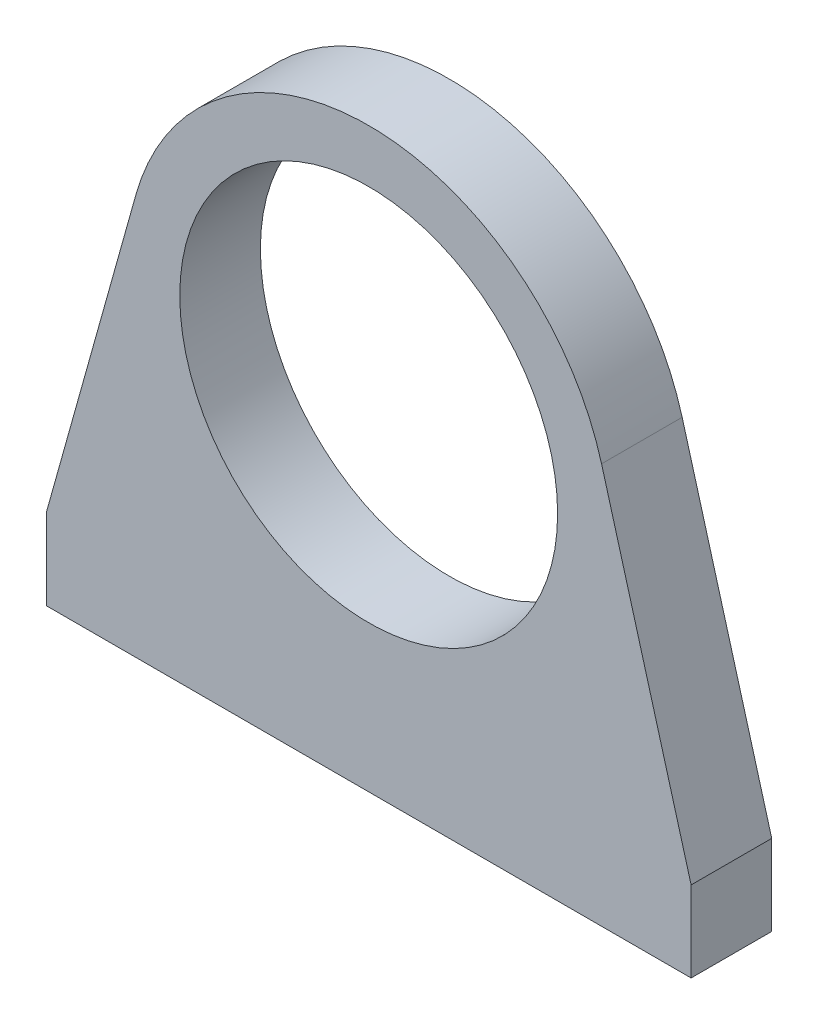
ISO-10303-21;
HEADER;
FILE_DESCRIPTION(('STEP AP214'),'2;1');
FILE_NAME('part.step','',(''),(''),'','','');
FILE_SCHEMA(('AUTOMOTIVE_DESIGN { 1 0 10303 214 1 1 1 1 }'));
ENDSEC;
DATA;
#1=APPLICATION_CONTEXT('core data for automotive mechanical design processes');
#2=APPLICATION_PROTOCOL_DEFINITION('international standard','automotive_design',2000,#1);
#3=PRODUCT_CONTEXT('',#1,'mechanical');
#4=PRODUCT('Part','Part','',(#3));
#5=PRODUCT_RELATED_PRODUCT_CATEGORY('part','',(#4));
#6=PRODUCT_DEFINITION_FORMATION('','',#4);
#7=PRODUCT_DEFINITION_CONTEXT('part definition',#1,'design');
#8=PRODUCT_DEFINITION('design','',#6,#7);
#9=PRODUCT_DEFINITION_SHAPE('','',#8);
#10=(LENGTH_UNIT() NAMED_UNIT(*) SI_UNIT(.MILLI.,.METRE.));
#11=(NAMED_UNIT(*) PLANE_ANGLE_UNIT() SI_UNIT($,.RADIAN.));
#12=(NAMED_UNIT(*) SI_UNIT($,.STERADIAN.) SOLID_ANGLE_UNIT());
#13=UNCERTAINTY_MEASURE_WITH_UNIT(LENGTH_MEASURE(1.E-05),#10,'distance_accuracy_value','');
#14=(GEOMETRIC_REPRESENTATION_CONTEXT(3) GLOBAL_UNCERTAINTY_ASSIGNED_CONTEXT((#13)) GLOBAL_UNIT_ASSIGNED_CONTEXT((#10,
#11,#12)) REPRESENTATION_CONTEXT('',''));
#15=CARTESIAN_POINT('',(0.,0.,0.));
#16=DIRECTION('',(0.,0.,1.));
#17=DIRECTION('',(1.,0.,0.));
#18=AXIS2_PLACEMENT_3D('',#15,#16,#17);
#19=CARTESIAN_POINT('',(18.3446820174153,31.5516734397662,6.35));
#20=DIRECTION('',(0.962975433985055,0.269589156943107,0.));
#21=DIRECTION('',(-0.269589156943107,0.962975433985055,0.));
#22=AXIS2_PLACEMENT_3D('',#19,#20,#21);
#23=PLANE('',#22);
#24=DIRECTION('',(0.269589156943107,-0.962975433985055,0.));
#25=VECTOR('',#24,1.);
#26=CARTESIAN_POINT('',(18.3446820174153,31.5516734397662,0.));
#27=LINE('',#26,#25);
#28=CARTESIAN_POINT('',(18.3446820174153,31.5516734397662,0.));
#29=VERTEX_POINT('',#28);
#30=CARTESIAN_POINT('',(25.4,6.35,0.));
#31=VERTEX_POINT('',#30);
#32=EDGE_CURVE('E138',#29,#31,#27,.T.);
#33=ORIENTED_EDGE('',*,*,#32,.F.);
#34=DIRECTION('',(0.,0.,-1.));
#35=VECTOR('',#34,1.);
#36=CARTESIAN_POINT('',(18.3446820174153,31.5516734397662,6.35));
#37=LINE('',#36,#35);
#38=CARTESIAN_POINT('',(18.3446820174153,31.5516734397662,6.35));
#39=VERTEX_POINT('',#38);
#40=EDGE_CURVE('E11',#39,#29,#37,.T.);
#41=ORIENTED_EDGE('',*,*,#40,.F.);
#42=DIRECTION('',(0.269589156943107,-0.962975433985055,0.));
#43=VECTOR('',#42,1.);
#44=CARTESIAN_POINT('',(18.3446820174153,31.5516734397662,6.35));
#45=LINE('',#44,#43);
#46=CARTESIAN_POINT('',(25.4,6.35,6.35));
#47=VERTEX_POINT('',#46);
#48=EDGE_CURVE('E158',#39,#47,#45,.T.);
#49=ORIENTED_EDGE('',*,*,#48,.T.);
#50=DIRECTION('',(0.,0.,-1.));
#51=VECTOR('',#50,1.);
#52=CARTESIAN_POINT('',(25.4,6.35,6.35));
#53=LINE('',#52,#51);
#54=EDGE_CURVE('E50',#47,#31,#53,.T.);
#55=ORIENTED_EDGE('',*,*,#54,.T.);
#56=EDGE_LOOP('',(#33,#41,#49,#55));
#57=FACE_BOUND('',#56,.T.);
#58=ADVANCED_FACE('F47',(#57),#23,.T.);
#59=CARTESIAN_POINT('',(0.,26.416,6.35));
#60=DIRECTION('',(0.,0.,-1.));
#61=DIRECTION('',(-1.,0.,0.));
#62=AXIS2_PLACEMENT_3D('',#59,#60,#61);
#63=CYLINDRICAL_SURFACE('',#62,19.05);
#64=CARTESIAN_POINT('',(0.,26.416,0.));
#65=DIRECTION('',(0.,0.,1.));
#66=DIRECTION('',(1.,0.,0.));
#67=AXIS2_PLACEMENT_3D('',#64,#65,#66);
#68=CIRCLE('',#67,19.05);
#69=CARTESIAN_POINT('',(-18.3446820174153,31.5516734397662,0.));
#70=VERTEX_POINT('',#69);
#71=EDGE_CURVE('E156',#29,#70,#68,.T.);
#72=ORIENTED_EDGE('',*,*,#71,.T.);
#73=DIRECTION('',(0.,0.,-1.));
#74=VECTOR('',#73,1.);
#75=CARTESIAN_POINT('',(-18.3446820174153,31.5516734397662,6.35));
#76=LINE('',#75,#74);
#77=CARTESIAN_POINT('',(-18.3446820174153,31.5516734397662,6.35));
#78=VERTEX_POINT('',#77);
#79=EDGE_CURVE('E57',#78,#70,#76,.T.);
#80=ORIENTED_EDGE('',*,*,#79,.F.);
#81=CARTESIAN_POINT('',(0.,26.416,6.35));
#82=DIRECTION('',(0.,0.,1.));
#83=DIRECTION('',(1.,0.,0.));
#84=AXIS2_PLACEMENT_3D('',#81,#82,#83);
#85=CIRCLE('',#84,19.05);
#86=EDGE_CURVE('E123',#39,#78,#85,.T.);
#87=ORIENTED_EDGE('',*,*,#86,.F.);
#88=ORIENTED_EDGE('',*,*,#40,.T.);
#89=EDGE_LOOP('',(#72,#80,#87,#88));
#90=FACE_BOUND('',#89,.T.);
#91=ADVANCED_FACE('F171',(#90),#63,.T.);
#92=CARTESIAN_POINT('',(-25.4,6.35,6.35));
#93=DIRECTION('',(-0.962975433985055,0.269589156943107,0.));
#94=DIRECTION('',(-0.269589156943107,-0.962975433985055,0.));
#95=AXIS2_PLACEMENT_3D('',#92,#93,#94);
#96=PLANE('',#95);
#97=DIRECTION('',(0.269589156943107,0.962975433985055,0.));
#98=VECTOR('',#97,1.);
#99=CARTESIAN_POINT('',(-25.4,6.35,0.));
#100=LINE('',#99,#98);
#101=CARTESIAN_POINT('',(-25.4,6.35,0.));
#102=VERTEX_POINT('',#101);
#103=EDGE_CURVE('E110',#102,#70,#100,.T.);
#104=ORIENTED_EDGE('',*,*,#103,.F.);
#105=DIRECTION('',(0.,0.,-1.));
#106=VECTOR('',#105,1.);
#107=CARTESIAN_POINT('',(-25.4,6.35,6.35));
#108=LINE('',#107,#106);
#109=CARTESIAN_POINT('',(-25.4,6.35,6.35));
#110=VERTEX_POINT('',#109);
#111=EDGE_CURVE('E105',#110,#102,#108,.T.);
#112=ORIENTED_EDGE('',*,*,#111,.F.);
#113=DIRECTION('',(0.269589156943107,0.962975433985055,0.));
#114=VECTOR('',#113,1.);
#115=CARTESIAN_POINT('',(-25.4,6.35,6.35));
#116=LINE('',#115,#114);
#117=EDGE_CURVE('E108',#110,#78,#116,.T.);
#118=ORIENTED_EDGE('',*,*,#117,.T.);
#119=ORIENTED_EDGE('',*,*,#79,.T.);
#120=EDGE_LOOP('',(#104,#112,#118,#119));
#121=FACE_BOUND('',#120,.T.);
#122=ADVANCED_FACE('F107',(#121),#96,.T.);
#123=CARTESIAN_POINT('',(-25.4,0.,6.35));
#124=DIRECTION('',(-1.,0.,0.));
#125=DIRECTION('',(0.,0.,1.));
#126=AXIS2_PLACEMENT_3D('',#123,#124,#125);
#127=PLANE('',#126);
#128=DIRECTION('',(0.,1.,0.));
#129=VECTOR('',#128,1.);
#130=CARTESIAN_POINT('',(-25.4,0.,0.));
#131=LINE('',#130,#129);
#132=CARTESIAN_POINT('',(-25.4,0.,0.));
#133=VERTEX_POINT('',#132);
#134=EDGE_CURVE('E151',#133,#102,#131,.T.);
#135=ORIENTED_EDGE('',*,*,#134,.F.);
#136=DIRECTION('',(0.,0.,-1.));
#137=VECTOR('',#136,1.);
#138=CARTESIAN_POINT('',(-25.4,0.,6.35));
#139=LINE('',#138,#137);
#140=CARTESIAN_POINT('',(-25.4,0.,6.35));
#141=VERTEX_POINT('',#140);
#142=EDGE_CURVE('E116',#141,#133,#139,.T.);
#143=ORIENTED_EDGE('',*,*,#142,.F.);
#144=DIRECTION('',(0.,1.,0.));
#145=VECTOR('',#144,1.);
#146=CARTESIAN_POINT('',(-25.4,0.,6.35));
#147=LINE('',#146,#145);
#148=EDGE_CURVE('E122',#141,#110,#147,.T.);
#149=ORIENTED_EDGE('',*,*,#148,.T.);
#150=ORIENTED_EDGE('',*,*,#111,.T.);
#151=EDGE_LOOP('',(#135,#143,#149,#150));
#152=FACE_BOUND('',#151,.T.);
#153=ADVANCED_FACE('F127',(#152),#127,.T.);
#154=CARTESIAN_POINT('',(0.,0.,6.35));
#155=DIRECTION('',(0.,-1.,0.));
#156=DIRECTION('',(1.,0.,0.));
#157=AXIS2_PLACEMENT_3D('',#154,#155,#156);
#158=PLANE('',#157);
#159=DIRECTION('',(-1.,0.,0.));
#160=VECTOR('',#159,1.);
#161=CARTESIAN_POINT('',(0.,0.,0.));
#162=LINE('',#161,#160);
#163=CARTESIAN_POINT('',(25.4,0.,0.));
#164=VERTEX_POINT('',#163);
#165=EDGE_CURVE('E147',#164,#133,#162,.T.);
#166=ORIENTED_EDGE('',*,*,#165,.F.);
#167=DIRECTION('',(0.,0.,-1.));
#168=VECTOR('',#167,1.);
#169=CARTESIAN_POINT('',(25.4,0.,6.35));
#170=LINE('',#169,#168);
#171=CARTESIAN_POINT('',(25.4,0.,6.35));
#172=VERTEX_POINT('',#171);
#173=EDGE_CURVE('E163',#172,#164,#170,.T.);
#174=ORIENTED_EDGE('',*,*,#173,.F.);
#175=DIRECTION('',(1.,0.,0.));
#176=VECTOR('',#175,1.);
#177=CARTESIAN_POINT('',(0.,0.,6.35));
#178=LINE('',#177,#176);
#179=EDGE_CURVE('E129',#141,#172,#178,.T.);
#180=ORIENTED_EDGE('',*,*,#179,.F.);
#181=ORIENTED_EDGE('',*,*,#142,.T.);
#182=EDGE_LOOP('',(#166,#174,#180,#181));
#183=FACE_BOUND('',#182,.T.);
#184=ADVANCED_FACE('F195',(#183),#158,.T.);
#185=CARTESIAN_POINT('',(25.4,6.35,6.35));
#186=DIRECTION('',(1.,0.,0.));
#187=DIRECTION('',(0.,0.,-1.));
#188=AXIS2_PLACEMENT_3D('',#185,#186,#187);
#189=PLANE('',#188);
#190=DIRECTION('',(0.,-1.,0.));
#191=VECTOR('',#190,1.);
#192=CARTESIAN_POINT('',(25.4,6.35,0.));
#193=LINE('',#192,#191);
#194=EDGE_CURVE('E142',#31,#164,#193,.T.);
#195=ORIENTED_EDGE('',*,*,#194,.F.);
#196=ORIENTED_EDGE('',*,*,#54,.F.);
#197=DIRECTION('',(0.,-1.,0.));
#198=VECTOR('',#197,1.);
#199=CARTESIAN_POINT('',(25.4,6.35,6.35));
#200=LINE('',#199,#198);
#201=EDGE_CURVE('E132',#47,#172,#200,.T.);
#202=ORIENTED_EDGE('',*,*,#201,.T.);
#203=ORIENTED_EDGE('',*,*,#173,.T.);
#204=EDGE_LOOP('',(#195,#196,#202,#203));
#205=FACE_BOUND('',#204,.T.);
#206=ADVANCED_FACE('F168',(#205),#189,.T.);
#207=CARTESIAN_POINT('',(0.,26.416,6.35));
#208=DIRECTION('',(0.,0.,1.));
#209=DIRECTION('',(1.,0.,0.));
#210=AXIS2_PLACEMENT_3D('',#207,#208,#209);
#211=PLANE('',#210);
#212=CARTESIAN_POINT('',(0.,26.416,6.35));
#213=DIRECTION('',(0.,0.,1.));
#214=DIRECTION('',(1.,0.,0.));
#215=AXIS2_PLACEMENT_3D('',#212,#213,#214);
#216=CIRCLE('',#215,14.88313);
#217=CARTESIAN_POINT('',(14.88313,26.416,6.35));
#218=VERTEX_POINT('',#217);
#219=EDGE_CURVE('E179',#218,#218,#216,.T.);
#220=ORIENTED_EDGE('',*,*,#219,.F.);
#221=EDGE_LOOP('',(#220));
#222=FACE_BOUND('',#221,.T.);
#223=ORIENTED_EDGE('',*,*,#48,.F.);
#224=ORIENTED_EDGE('',*,*,#86,.T.);
#225=ORIENTED_EDGE('',*,*,#117,.F.);
#226=ORIENTED_EDGE('',*,*,#148,.F.);
#227=ORIENTED_EDGE('',*,*,#179,.T.);
#228=ORIENTED_EDGE('',*,*,#201,.F.);
#229=EDGE_LOOP('',(#223,#224,#225,#226,#227,#228));
#230=FACE_BOUND('',#229,.T.);
#231=ADVANCED_FACE('F121',(#222,#230),#211,.T.);
#232=CARTESIAN_POINT('',(0.,26.416,0.));
#233=DIRECTION('',(0.,0.,1.));
#234=DIRECTION('',(1.,0.,0.));
#235=AXIS2_PLACEMENT_3D('',#232,#233,#234);
#236=PLANE('',#235);
#237=CARTESIAN_POINT('',(0.,26.416,0.));
#238=DIRECTION('',(0.,0.,1.));
#239=DIRECTION('',(1.,0.,0.));
#240=AXIS2_PLACEMENT_3D('',#237,#238,#239);
#241=CIRCLE('',#240,14.88313);
#242=CARTESIAN_POINT('',(14.88313,26.416,0.));
#243=VERTEX_POINT('',#242);
#244=EDGE_CURVE('E143',#243,#243,#241,.T.);
#245=ORIENTED_EDGE('',*,*,#244,.T.);
#246=EDGE_LOOP('',(#245));
#247=FACE_BOUND('',#246,.T.);
#248=ORIENTED_EDGE('',*,*,#32,.T.);
#249=ORIENTED_EDGE('',*,*,#194,.T.);
#250=ORIENTED_EDGE('',*,*,#165,.T.);
#251=ORIENTED_EDGE('',*,*,#134,.T.);
#252=ORIENTED_EDGE('',*,*,#103,.T.);
#253=ORIENTED_EDGE('',*,*,#71,.F.);
#254=EDGE_LOOP('',(#248,#249,#250,#251,#252,#253));
#255=FACE_BOUND('',#254,.T.);
#256=ADVANCED_FACE('F170',(#247,#255),#236,.F.);
#257=CARTESIAN_POINT('',(0.,26.416,6.35));
#258=DIRECTION('',(0.,0.,1.));
#259=DIRECTION('',(1.,0.,0.));
#260=AXIS2_PLACEMENT_3D('',#257,#258,#259);
#261=CYLINDRICAL_SURFACE('',#260,14.88313);
#262=ORIENTED_EDGE('',*,*,#219,.T.);
#263=EDGE_LOOP('',(#262));
#264=FACE_BOUND('',#263,.T.);
#265=ORIENTED_EDGE('',*,*,#244,.F.);
#266=EDGE_LOOP('',(#265));
#267=FACE_BOUND('',#266,.T.);
#268=ADVANCED_FACE('F184',(#264,#267),#261,.F.);
#269=CLOSED_SHELL('',(#58,#91,#122,#153,#184,#206,#231,#256,#268));
#270=MANIFOLD_SOLID_BREP('B2',#269);
#271=ADVANCED_BREP_SHAPE_REPRESENTATION('',(#18,#270),#14);
#272=SHAPE_DEFINITION_REPRESENTATION(#9,#271);
ENDSEC;
END-ISO-10303-21;
